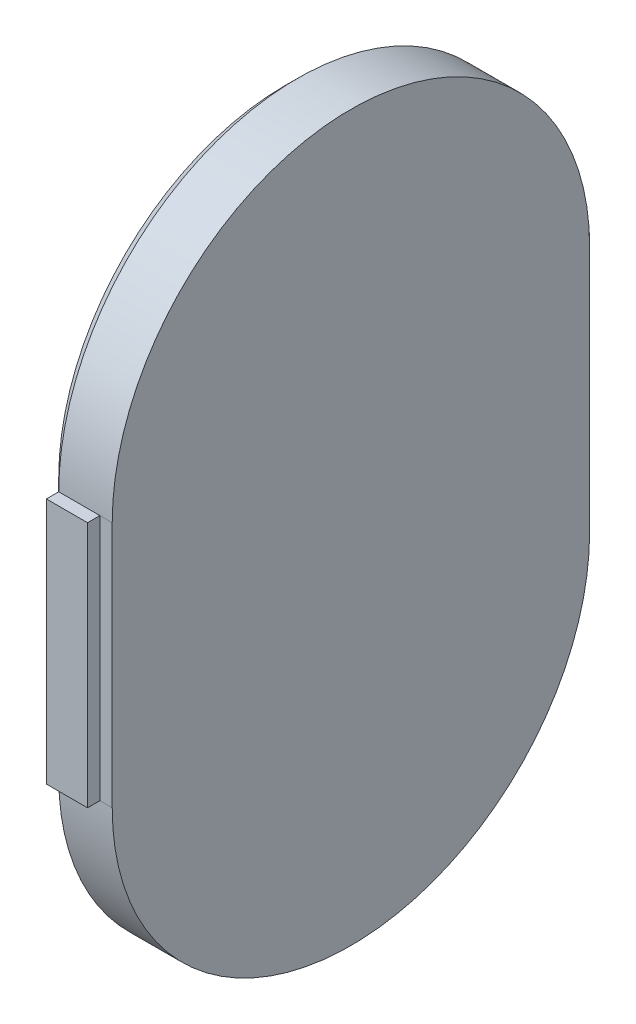
ISO-10303-21;
HEADER;
FILE_DESCRIPTION(('STEP AP214'),'2;1');
FILE_NAME('part.step','',(''),(''),'','','');
FILE_SCHEMA(('AUTOMOTIVE_DESIGN { 1 0 10303 214 1 1 1 1 }'));
ENDSEC;
DATA;
#1=APPLICATION_CONTEXT('core data for automotive mechanical design processes');
#2=APPLICATION_PROTOCOL_DEFINITION('international standard','automotive_design',2000,#1);
#3=PRODUCT_CONTEXT('',#1,'mechanical');
#4=PRODUCT('Part','Part','',(#3));
#5=PRODUCT_RELATED_PRODUCT_CATEGORY('part','',(#4));
#6=PRODUCT_DEFINITION_FORMATION('','',#4);
#7=PRODUCT_DEFINITION_CONTEXT('part definition',#1,'design');
#8=PRODUCT_DEFINITION('design','',#6,#7);
#9=PRODUCT_DEFINITION_SHAPE('','',#8);
#10=(LENGTH_UNIT() NAMED_UNIT(*) SI_UNIT(.MILLI.,.METRE.));
#11=(NAMED_UNIT(*) PLANE_ANGLE_UNIT() SI_UNIT($,.RADIAN.));
#12=(NAMED_UNIT(*) SI_UNIT($,.STERADIAN.) SOLID_ANGLE_UNIT());
#13=UNCERTAINTY_MEASURE_WITH_UNIT(LENGTH_MEASURE(1.E-05),#10,'distance_accuracy_value','');
#14=(GEOMETRIC_REPRESENTATION_CONTEXT(3) GLOBAL_UNCERTAINTY_ASSIGNED_CONTEXT((#13)) GLOBAL_UNIT_ASSIGNED_CONTEXT((#10,
#11,#12)) REPRESENTATION_CONTEXT('',''));
#15=CARTESIAN_POINT('',(0.,0.,0.));
#16=DIRECTION('',(0.,0.,1.));
#17=DIRECTION('',(1.,0.,0.));
#18=AXIS2_PLACEMENT_3D('',#15,#16,#17);
#19=CARTESIAN_POINT('',(-61.4,110.,67.4));
#20=DIRECTION('',(-1.,0.,0.));
#21=DIRECTION('',(0.,0.,1.));
#22=AXIS2_PLACEMENT_3D('',#19,#20,#21);
#23=CYLINDRICAL_SURFACE('',#22,5.8);
#24=DIRECTION('',(-1.,0.,0.));
#25=VECTOR('',#24,1.);
#26=CARTESIAN_POINT('',(-61.4,104.397322068867,68.9));
#27=LINE('',#26,#25);
#28=CARTESIAN_POINT('',(-62.4,104.397322068867,68.9));
#29=VERTEX_POINT('',#28);
#30=CARTESIAN_POINT('',(-62.7,104.397322068867,68.9));
#31=VERTEX_POINT('',#30);
#32=EDGE_CURVE('E210',#29,#31,#27,.T.);
#33=ORIENTED_EDGE('',*,*,#32,.F.);
#34=CARTESIAN_POINT('',(-62.4,110.,67.4));
#35=DIRECTION('',(-1.,0.,0.));
#36=DIRECTION('',(0.,0.,1.));
#37=AXIS2_PLACEMENT_3D('',#34,#35,#36);
#38=CIRCLE('',#37,5.8);
#39=CARTESIAN_POINT('',(-62.4,104.397322068867,65.9));
#40=VERTEX_POINT('',#39);
#41=EDGE_CURVE('E11',#40,#29,#38,.T.);
#42=ORIENTED_EDGE('',*,*,#41,.F.);
#43=DIRECTION('',(-1.,0.,0.));
#44=VECTOR('',#43,1.);
#45=CARTESIAN_POINT('',(-61.4,104.397322068867,65.9));
#46=LINE('',#45,#44);
#47=CARTESIAN_POINT('',(-62.7,104.397322068867,65.9));
#48=VERTEX_POINT('',#47);
#49=EDGE_CURVE('E204',#40,#48,#46,.T.);
#50=ORIENTED_EDGE('',*,*,#49,.T.);
#51=CARTESIAN_POINT('',(-62.7,110.,67.4));
#52=DIRECTION('',(-1.,0.,0.));
#53=DIRECTION('',(0.,0.,1.));
#54=AXIS2_PLACEMENT_3D('',#51,#52,#53);
#55=CIRCLE('',#54,5.8);
#56=CARTESIAN_POINT('',(-62.7,110.,61.6));
#57=VERTEX_POINT('',#56);
#58=EDGE_CURVE('E312',#48,#57,#55,.F.);
#59=ORIENTED_EDGE('',*,*,#58,.T.);
#60=DIRECTION('',(-1.,0.,0.));
#61=VECTOR('',#60,1.);
#62=CARTESIAN_POINT('',(-61.4,110.,61.6));
#63=LINE('',#62,#61);
#64=CARTESIAN_POINT('',(-61.7,110.,61.6));
#65=VERTEX_POINT('',#64);
#66=EDGE_CURVE('E307',#65,#57,#63,.T.);
#67=ORIENTED_EDGE('',*,*,#66,.F.);
#68=CARTESIAN_POINT('',(-61.4,110.,61.6));
#69=VERTEX_POINT('',#68);
#70=EDGE_CURVE('E308',#69,#65,#63,.T.);
#71=ORIENTED_EDGE('',*,*,#70,.F.);
#72=CARTESIAN_POINT('',(-61.4,110.,67.4));
#73=DIRECTION('',(1.,0.,0.));
#74=DIRECTION('',(0.,0.,1.));
#75=AXIS2_PLACEMENT_3D('',#72,#73,#74);
#76=CIRCLE('',#75,5.8);
#77=CARTESIAN_POINT('',(-61.4,110.,73.2));
#78=VERTEX_POINT('',#77);
#79=EDGE_CURVE('E279',#78,#69,#76,.T.);
#80=ORIENTED_EDGE('',*,*,#79,.F.);
#81=DIRECTION('',(-1.,0.,0.));
#82=VECTOR('',#81,1.);
#83=CARTESIAN_POINT('',(-61.4,110.,73.2));
#84=LINE('',#83,#82);
#85=CARTESIAN_POINT('',(-61.7,110.,73.2));
#86=VERTEX_POINT('',#85);
#87=EDGE_CURVE('E295',#78,#86,#84,.T.);
#88=ORIENTED_EDGE('',*,*,#87,.T.);
#89=CARTESIAN_POINT('',(-62.7,110.,73.2));
#90=VERTEX_POINT('',#89);
#91=EDGE_CURVE('E294',#86,#90,#84,.T.);
#92=ORIENTED_EDGE('',*,*,#91,.T.);
#93=EDGE_CURVE('E313',#90,#31,#55,.F.);
#94=ORIENTED_EDGE('',*,*,#93,.T.);
#95=EDGE_LOOP('',(#33,#42,#50,#59,#67,#71,#80,#88,#92,#94));
#96=FACE_BOUND('',#95,.T.);
#97=ADVANCED_FACE('F49',(#96),#23,.T.);
#98=CARTESIAN_POINT('',(-63.,110.,67.4));
#99=DIRECTION('',(-1.,0.,0.));
#100=DIRECTION('',(0.,0.,1.));
#101=AXIS2_PLACEMENT_3D('',#98,#99,#100);
#102=PLANE('',#101);
#103=DIRECTION('',(0.,0.,1.));
#104=VECTOR('',#103,1.);
#105=CARTESIAN_POINT('',(-63.,105.4,67.4));
#106=LINE('',#105,#104);
#107=CARTESIAN_POINT('',(-63.,105.4,65.9));
#108=VERTEX_POINT('',#107);
#109=CARTESIAN_POINT('',(-63.,105.4,68.9));
#110=VERTEX_POINT('',#109);
#111=EDGE_CURVE('E59',#108,#110,#106,.T.);
#112=ORIENTED_EDGE('',*,*,#111,.T.);
#113=DIRECTION('',(0.,-1.,0.));
#114=VECTOR('',#113,1.);
#115=CARTESIAN_POINT('',(-63.,110.,68.9));
#116=LINE('',#115,#114);
#117=CARTESIAN_POINT('',(-63.,104.708497377871,68.9));
#118=VERTEX_POINT('',#117);
#119=EDGE_CURVE('E193',#110,#118,#116,.T.);
#120=ORIENTED_EDGE('',*,*,#119,.T.);
#121=CARTESIAN_POINT('',(-63.,110.,67.4));
#122=DIRECTION('',(-1.,0.,0.));
#123=DIRECTION('',(0.,0.,1.));
#124=AXIS2_PLACEMENT_3D('',#121,#122,#123);
#125=CIRCLE('',#124,5.50000000000001);
#126=CARTESIAN_POINT('',(-63.,110.,72.9));
#127=VERTEX_POINT('',#126);
#128=EDGE_CURVE('E326',#118,#127,#125,.T.);
#129=ORIENTED_EDGE('',*,*,#128,.T.);
#130=DIRECTION('',(0.,1.,0.));
#131=VECTOR('',#130,1.);
#132=CARTESIAN_POINT('',(-63.,116.,72.9));
#133=LINE('',#132,#131);
#134=CARTESIAN_POINT('',(-63.,116.,72.9));
#135=VERTEX_POINT('',#134);
#136=EDGE_CURVE('E320',#127,#135,#133,.T.);
#137=ORIENTED_EDGE('',*,*,#136,.T.);
#138=CARTESIAN_POINT('',(-63.,116.,67.4));
#139=DIRECTION('',(-1.,0.,0.));
#140=DIRECTION('',(0.,0.,1.));
#141=AXIS2_PLACEMENT_3D('',#138,#139,#140);
#142=CIRCLE('',#141,5.50000000000001);
#143=CARTESIAN_POINT('',(-63.,116.,61.9));
#144=VERTEX_POINT('',#143);
#145=EDGE_CURVE('E317',#135,#144,#142,.T.);
#146=ORIENTED_EDGE('',*,*,#145,.T.);
#147=DIRECTION('',(0.,-1.,0.));
#148=VECTOR('',#147,1.);
#149=CARTESIAN_POINT('',(-63.,110.,61.9));
#150=LINE('',#149,#148);
#151=CARTESIAN_POINT('',(-63.,110.,61.9));
#152=VERTEX_POINT('',#151);
#153=EDGE_CURVE('E323',#144,#152,#150,.T.);
#154=ORIENTED_EDGE('',*,*,#153,.T.);
#155=CARTESIAN_POINT('',(-63.,104.708497377871,65.9));
#156=VERTEX_POINT('',#155);
#157=EDGE_CURVE('E327',#152,#156,#125,.T.);
#158=ORIENTED_EDGE('',*,*,#157,.T.);
#159=DIRECTION('',(0.,-1.,0.));
#160=VECTOR('',#159,1.);
#161=CARTESIAN_POINT('',(-63.,110.,65.9));
#162=LINE('',#161,#160);
#163=EDGE_CURVE('E66',#108,#156,#162,.T.);
#164=ORIENTED_EDGE('',*,*,#163,.F.);
#165=EDGE_LOOP('',(#112,#120,#129,#137,#146,#154,#158,#164));
#166=FACE_BOUND('',#165,.T.);
#167=ADVANCED_FACE('F429',(#166),#102,.T.);
#168=CARTESIAN_POINT('',(-62.7,110.,67.4));
#169=DIRECTION('',(1.,0.,0.));
#170=DIRECTION('',(0.,0.,-1.));
#171=AXIS2_PLACEMENT_3D('',#168,#169,#170);
#172=CONICAL_SURFACE('',#171,5.8,0.785398163397448);
#173=ORIENTED_EDGE('',*,*,#128,.F.);
#174=CARTESIAN_POINT('',(-64.2371316876853,106.00975611671,68.9));
#175=CARTESIAN_POINT('',(-64.1231499809189,105.887999964926,68.9));
#176=CARTESIAN_POINT('',(-64.0088383775944,105.766553873108,68.9));
#177=CARTESIAN_POINT('',(-63.7796767548246,105.524172135007,68.9));
#178=CARTESIAN_POINT('',(-63.6648267390506,105.403236485253,68.9));
#179=CARTESIAN_POINT('',(-63.3196546032696,105.041034299892,68.9));
#180=CARTESIAN_POINT('',(-63.088704633507,104.800366398064,68.9));
#181=CARTESIAN_POINT('',(-62.6257121524155,104.320093699818,68.9));
#182=CARTESIAN_POINT('',(-62.3936696597395,104.080488885385,68.9));
#183=CARTESIAN_POINT('',(-61.9287883147822,103.602040927902,68.9));
#184=CARTESIAN_POINT('',(-61.6959494424737,103.363197804304,68.9));
#185=CARTESIAN_POINT('',(-61.4628683123147,103.124592929155,68.9));
#186=B_SPLINE_CURVE_WITH_KNOTS('',3,(#174,#175,#176,#177,#178,#179,#180,#181,#182,#183,#184,
#185),.UNSPECIFIED.,.F.,.F.,(4,2,2,2,2,4),(0.,0.500345452602869,1.00068749826315,
2.00134635262799,3.00198818415704,4.00265536751893),.UNSPECIFIED.);
#187=EDGE_CURVE('E364',#118,#31,#186,.T.);
#188=ORIENTED_EDGE('',*,*,#187,.T.);
#189=ORIENTED_EDGE('',*,*,#93,.F.);
#190=DIRECTION('',(-0.707106781186547,0.,-0.707106781186547));
#191=VECTOR('',#190,1.);
#192=CARTESIAN_POINT('',(-62.7,110.,73.2));
#193=LINE('',#192,#191);
#194=EDGE_CURVE('E346',#90,#127,#193,.T.);
#195=ORIENTED_EDGE('',*,*,#194,.T.);
#196=EDGE_LOOP('',(#173,#188,#189,#195));
#197=FACE_BOUND('',#196,.T.);
#198=ADVANCED_FACE('F432',(#197),#172,.T.);
#199=CARTESIAN_POINT('',(-61.4,110.,73.2));
#200=DIRECTION('',(0.,0.,-1.));
#201=DIRECTION('',(-1.,0.,0.));
#202=AXIS2_PLACEMENT_3D('',#199,#200,#201);
#203=PLANE('',#202);
#204=DIRECTION('',(0.,1.,0.));
#205=VECTOR('',#204,1.);
#206=CARTESIAN_POINT('',(-61.7,110.,73.2));
#207=LINE('',#206,#205);
#208=CARTESIAN_POINT('',(-61.7,116.,73.2));
#209=VERTEX_POINT('',#208);
#210=EDGE_CURVE('E242',#86,#209,#207,.T.);
#211=ORIENTED_EDGE('',*,*,#210,.F.);
#212=ORIENTED_EDGE('',*,*,#87,.F.);
#213=DIRECTION('',(0.,-1.,0.));
#214=VECTOR('',#213,1.);
#215=CARTESIAN_POINT('',(-61.4,110.,73.2));
#216=LINE('',#215,#214);
#217=CARTESIAN_POINT('',(-61.4,116.,73.2));
#218=VERTEX_POINT('',#217);
#219=EDGE_CURVE('E290',#218,#78,#216,.T.);
#220=ORIENTED_EDGE('',*,*,#219,.F.);
#221=DIRECTION('',(-1.,0.,0.));
#222=VECTOR('',#221,1.);
#223=CARTESIAN_POINT('',(-61.4,116.,73.2));
#224=LINE('',#223,#222);
#225=EDGE_CURVE('E299',#218,#209,#224,.T.);
#226=ORIENTED_EDGE('',*,*,#225,.T.);
#227=EDGE_LOOP('',(#211,#212,#220,#226));
#228=FACE_BOUND('',#227,.T.);
#229=ADVANCED_FACE('F437',(#228),#203,.F.);
#230=CARTESIAN_POINT('',(-61.4,116.,61.6));
#231=DIRECTION('',(0.,0.,1.));
#232=DIRECTION('',(1.,0.,0.));
#233=AXIS2_PLACEMENT_3D('',#230,#231,#232);
#234=PLANE('',#233);
#235=DIRECTION('',(0.,-1.,0.));
#236=VECTOR('',#235,1.);
#237=CARTESIAN_POINT('',(-61.7,116.,61.6));
#238=LINE('',#237,#236);
#239=CARTESIAN_POINT('',(-61.7,116.,61.6));
#240=VERTEX_POINT('',#239);
#241=EDGE_CURVE('E274',#240,#65,#238,.T.);
#242=ORIENTED_EDGE('',*,*,#241,.F.);
#243=DIRECTION('',(-1.,0.,0.));
#244=VECTOR('',#243,1.);
#245=CARTESIAN_POINT('',(-61.4,116.,61.6));
#246=LINE('',#245,#244);
#247=CARTESIAN_POINT('',(-61.4,116.,61.6));
#248=VERTEX_POINT('',#247);
#249=EDGE_CURVE('E303',#248,#240,#246,.T.);
#250=ORIENTED_EDGE('',*,*,#249,.F.);
#251=DIRECTION('',(0.,1.,0.));
#252=VECTOR('',#251,1.);
#253=CARTESIAN_POINT('',(-61.4,116.,61.6));
#254=LINE('',#253,#252);
#255=EDGE_CURVE('E283',#69,#248,#254,.T.);
#256=ORIENTED_EDGE('',*,*,#255,.F.);
#257=ORIENTED_EDGE('',*,*,#70,.T.);
#258=EDGE_LOOP('',(#242,#250,#256,#257));
#259=FACE_BOUND('',#258,.T.);
#260=ADVANCED_FACE('F440',(#259),#234,.F.);
#261=CARTESIAN_POINT('',(-61.4,116.,67.4));
#262=DIRECTION('',(-1.,0.,0.));
#263=DIRECTION('',(0.,0.,1.));
#264=AXIS2_PLACEMENT_3D('',#261,#262,#263);
#265=CYLINDRICAL_SURFACE('',#264,5.8);
#266=ORIENTED_EDGE('',*,*,#249,.T.);
#267=CARTESIAN_POINT('',(-62.7,116.,61.6));
#268=VERTEX_POINT('',#267);
#269=EDGE_CURVE('E302',#240,#268,#246,.T.);
#270=ORIENTED_EDGE('',*,*,#269,.T.);
#271=CARTESIAN_POINT('',(-62.7,116.,67.4));
#272=DIRECTION('',(-1.,0.,0.));
#273=DIRECTION('',(0.,0.,1.));
#274=AXIS2_PLACEMENT_3D('',#271,#272,#273);
#275=CIRCLE('',#274,5.8);
#276=CARTESIAN_POINT('',(-62.7,116.,73.2));
#277=VERTEX_POINT('',#276);
#278=EDGE_CURVE('E339',#268,#277,#275,.F.);
#279=ORIENTED_EDGE('',*,*,#278,.T.);
#280=EDGE_CURVE('E74',#209,#277,#224,.T.);
#281=ORIENTED_EDGE('',*,*,#280,.F.);
#282=ORIENTED_EDGE('',*,*,#225,.F.);
#283=CARTESIAN_POINT('',(-61.4,116.,67.4));
#284=DIRECTION('',(1.,0.,0.));
#285=DIRECTION('',(0.,0.,1.));
#286=AXIS2_PLACEMENT_3D('',#283,#284,#285);
#287=CIRCLE('',#286,5.8);
#288=EDGE_CURVE('E287',#248,#218,#287,.T.);
#289=ORIENTED_EDGE('',*,*,#288,.F.);
#290=EDGE_LOOP('',(#266,#270,#279,#281,#282,#289));
#291=FACE_BOUND('',#290,.T.);
#292=ADVANCED_FACE('F427',(#291),#265,.T.);
#293=CARTESIAN_POINT('',(-61.4,110.,67.4));
#294=DIRECTION('',(-1.,0.,0.));
#295=DIRECTION('',(0.,0.,1.));
#296=AXIS2_PLACEMENT_3D('',#293,#294,#295);
#297=PLANE('',#296);
#298=ORIENTED_EDGE('',*,*,#79,.T.);
#299=ORIENTED_EDGE('',*,*,#255,.T.);
#300=ORIENTED_EDGE('',*,*,#288,.T.);
#301=ORIENTED_EDGE('',*,*,#219,.T.);
#302=EDGE_LOOP('',(#298,#299,#300,#301));
#303=FACE_BOUND('',#302,.T.);
#304=ADVANCED_FACE('F424',(#303),#297,.F.);
#305=CARTESIAN_POINT('',(-62.7,116.,67.4));
#306=DIRECTION('',(1.,0.,0.));
#307=DIRECTION('',(0.,0.,-1.));
#308=AXIS2_PLACEMENT_3D('',#305,#306,#307);
#309=CONICAL_SURFACE('',#308,5.8,0.785398163397448);
#310=DIRECTION('',(0.707106781186547,0.,-0.707106781186547));
#311=VECTOR('',#310,1.);
#312=CARTESIAN_POINT('',(-63.,116.,61.9));
#313=LINE('',#312,#311);
#314=EDGE_CURVE('E350',#144,#268,#313,.T.);
#315=ORIENTED_EDGE('',*,*,#314,.F.);
#316=ORIENTED_EDGE('',*,*,#145,.F.);
#317=DIRECTION('',(-0.707106781186547,0.,-0.707106781186547));
#318=VECTOR('',#317,1.);
#319=CARTESIAN_POINT('',(-62.7,116.,73.2));
#320=LINE('',#319,#318);
#321=EDGE_CURVE('E284',#277,#135,#320,.T.);
#322=ORIENTED_EDGE('',*,*,#321,.F.);
#323=ORIENTED_EDGE('',*,*,#278,.F.);
#324=EDGE_LOOP('',(#315,#316,#322,#323));
#325=FACE_BOUND('',#324,.T.);
#326=ADVANCED_FACE('F52',(#325),#309,.T.);
#327=CARTESIAN_POINT('',(-62.7,110.,73.2));
#328=DIRECTION('',(-0.707106781186547,0.,0.707106781186547));
#329=DIRECTION('',(0.,1.,0.));
#330=AXIS2_PLACEMENT_3D('',#327,#328,#329);
#331=PLANE('',#330);
#332=ORIENTED_EDGE('',*,*,#321,.T.);
#333=ORIENTED_EDGE('',*,*,#136,.F.);
#334=ORIENTED_EDGE('',*,*,#194,.F.);
#335=DIRECTION('',(0.,-1.,0.));
#336=VECTOR('',#335,1.);
#337=CARTESIAN_POINT('',(-62.7,110.,73.2));
#338=LINE('',#337,#336);
#339=EDGE_CURVE('E335',#277,#90,#338,.T.);
#340=ORIENTED_EDGE('',*,*,#339,.F.);
#341=EDGE_LOOP('',(#332,#333,#334,#340));
#342=FACE_BOUND('',#341,.T.);
#343=ADVANCED_FACE('F489',(#342),#331,.T.);
#344=CARTESIAN_POINT('',(-62.7,116.,61.6));
#345=DIRECTION('',(-0.707106781186547,0.,-0.707106781186547));
#346=DIRECTION('',(0.,-1.,0.));
#347=AXIS2_PLACEMENT_3D('',#344,#345,#346);
#348=PLANE('',#347);
#349=ORIENTED_EDGE('',*,*,#314,.T.);
#350=DIRECTION('',(0.,1.,0.));
#351=VECTOR('',#350,1.);
#352=CARTESIAN_POINT('',(-62.7,116.,61.6));
#353=LINE('',#352,#351);
#354=EDGE_CURVE('E331',#57,#268,#353,.T.);
#355=ORIENTED_EDGE('',*,*,#354,.F.);
#356=DIRECTION('',(0.707106781186547,0.,-0.707106781186547));
#357=VECTOR('',#356,1.);
#358=CARTESIAN_POINT('',(-63.,110.,61.9));
#359=LINE('',#358,#357);
#360=EDGE_CURVE('E278',#152,#57,#359,.T.);
#361=ORIENTED_EDGE('',*,*,#360,.F.);
#362=ORIENTED_EDGE('',*,*,#153,.F.);
#363=EDGE_LOOP('',(#349,#355,#361,#362));
#364=FACE_BOUND('',#363,.T.);
#365=ADVANCED_FACE('F467',(#364),#348,.T.);
#366=CARTESIAN_POINT('',(-64.2371316876853,106.00975611671,65.9));
#367=CARTESIAN_POINT('',(-64.1231499809189,105.887999964926,65.9));
#368=CARTESIAN_POINT('',(-64.0088383775944,105.766553873108,65.9));
#369=CARTESIAN_POINT('',(-63.7796767548246,105.524172135007,65.9));
#370=CARTESIAN_POINT('',(-63.6648267390506,105.403236485253,65.9));
#371=CARTESIAN_POINT('',(-63.3196546032696,105.041034299892,65.9));
#372=CARTESIAN_POINT('',(-63.088704633507,104.800366398064,65.9));
#373=CARTESIAN_POINT('',(-62.6257121524155,104.320093699818,65.9));
#374=CARTESIAN_POINT('',(-62.3936696597395,104.080488885385,65.9));
#375=CARTESIAN_POINT('',(-61.9287883147822,103.602040927902,65.9));
#376=CARTESIAN_POINT('',(-61.6959494424737,103.363197804304,65.9));
#377=CARTESIAN_POINT('',(-61.4628683123147,103.124592929155,65.9));
#378=B_SPLINE_CURVE_WITH_KNOTS('',3,(#366,#367,#368,#369,#370,#371,#372,#373,#374,#375,#376,
#377),.UNSPECIFIED.,.F.,.F.,(4,2,2,2,2,4),(0.,0.500345452602869,1.00068749826315,
2.00134635262799,3.00198818415704,4.00265536751893),.UNSPECIFIED.);
#379=EDGE_CURVE('E342',#156,#48,#378,.T.);
#380=ORIENTED_EDGE('',*,*,#379,.F.);
#381=ORIENTED_EDGE('',*,*,#157,.F.);
#382=ORIENTED_EDGE('',*,*,#360,.T.);
#383=ORIENTED_EDGE('',*,*,#58,.F.);
#384=EDGE_LOOP('',(#380,#381,#382,#383));
#385=FACE_BOUND('',#384,.T.);
#386=ADVANCED_FACE('F371',(#385),#172,.T.);
#387=CARTESIAN_POINT('',(-62.7,116.,61.61));
#388=DIRECTION('',(0.,-1.,0.));
#389=DIRECTION('',(0.,0.,-1.));
#390=AXIS2_PLACEMENT_3D('',#387,#388,#389);
#391=PLANE('',#390);
#392=DIRECTION('',(0.,0.,-1.));
#393=VECTOR('',#392,1.);
#394=CARTESIAN_POINT('',(-62.7,116.,61.61));
#395=LINE('',#394,#393);
#396=CARTESIAN_POINT('',(-62.7,116.,61.3));
#397=VERTEX_POINT('',#396);
#398=EDGE_CURVE('E262',#268,#397,#395,.T.);
#399=ORIENTED_EDGE('',*,*,#398,.F.);
#400=ORIENTED_EDGE('',*,*,#269,.F.);
#401=DIRECTION('',(0.,0.,-1.));
#402=VECTOR('',#401,1.);
#403=CARTESIAN_POINT('',(-61.7,116.,61.61));
#404=LINE('',#403,#402);
#405=CARTESIAN_POINT('',(-61.7,116.,61.3));
#406=VERTEX_POINT('',#405);
#407=EDGE_CURVE('E265',#240,#406,#404,.T.);
#408=ORIENTED_EDGE('',*,*,#407,.T.);
#409=DIRECTION('',(-1.,0.,0.));
#410=VECTOR('',#409,1.);
#411=CARTESIAN_POINT('',(-62.7,116.,61.3));
#412=LINE('',#411,#410);
#413=EDGE_CURVE('E258',#406,#397,#412,.T.);
#414=ORIENTED_EDGE('',*,*,#413,.T.);
#415=EDGE_LOOP('',(#399,#400,#408,#414));
#416=FACE_BOUND('',#415,.T.);
#417=ADVANCED_FACE('F409',(#416),#391,.F.);
#418=CARTESIAN_POINT('',(-62.7,110.,61.61));
#419=DIRECTION('',(0.,1.,0.));
#420=DIRECTION('',(0.,0.,1.));
#421=AXIS2_PLACEMENT_3D('',#418,#419,#420);
#422=PLANE('',#421);
#423=DIRECTION('',(0.,0.,-1.));
#424=VECTOR('',#423,1.);
#425=CARTESIAN_POINT('',(-61.7,110.,61.61));
#426=LINE('',#425,#424);
#427=CARTESIAN_POINT('',(-61.7,110.,61.3));
#428=VERTEX_POINT('',#427);
#429=EDGE_CURVE('E268',#65,#428,#426,.T.);
#430=ORIENTED_EDGE('',*,*,#429,.F.);
#431=ORIENTED_EDGE('',*,*,#66,.T.);
#432=DIRECTION('',(0.,0.,-1.));
#433=VECTOR('',#432,1.);
#434=CARTESIAN_POINT('',(-62.7,110.,61.61));
#435=LINE('',#434,#433);
#436=CARTESIAN_POINT('',(-62.7,110.,61.3));
#437=VERTEX_POINT('',#436);
#438=EDGE_CURVE('E271',#57,#437,#435,.T.);
#439=ORIENTED_EDGE('',*,*,#438,.T.);
#440=DIRECTION('',(1.,0.,0.));
#441=VECTOR('',#440,1.);
#442=CARTESIAN_POINT('',(-62.7,110.,61.3));
#443=LINE('',#442,#441);
#444=EDGE_CURVE('E250',#437,#428,#443,.T.);
#445=ORIENTED_EDGE('',*,*,#444,.T.);
#446=EDGE_LOOP('',(#430,#431,#439,#445));
#447=FACE_BOUND('',#446,.T.);
#448=ADVANCED_FACE('F412',(#447),#422,.F.);
#449=CARTESIAN_POINT('',(-62.7,110.,61.61));
#450=DIRECTION('',(1.,0.,0.));
#451=DIRECTION('',(0.,0.,-1.));
#452=AXIS2_PLACEMENT_3D('',#449,#450,#451);
#453=PLANE('',#452);
#454=ORIENTED_EDGE('',*,*,#354,.T.);
#455=ORIENTED_EDGE('',*,*,#398,.T.);
#456=DIRECTION('',(0.,-1.,0.));
#457=VECTOR('',#456,1.);
#458=CARTESIAN_POINT('',(-62.7,110.,61.3));
#459=LINE('',#458,#457);
#460=EDGE_CURVE('E246',#397,#437,#459,.T.);
#461=ORIENTED_EDGE('',*,*,#460,.T.);
#462=ORIENTED_EDGE('',*,*,#438,.F.);
#463=EDGE_LOOP('',(#454,#455,#461,#462));
#464=FACE_BOUND('',#463,.T.);
#465=ADVANCED_FACE('F416',(#464),#453,.F.);
#466=CARTESIAN_POINT('',(-61.7,110.,61.61));
#467=DIRECTION('',(-1.,0.,0.));
#468=DIRECTION('',(0.,0.,1.));
#469=AXIS2_PLACEMENT_3D('',#466,#467,#468);
#470=PLANE('',#469);
#471=ORIENTED_EDGE('',*,*,#407,.F.);
#472=ORIENTED_EDGE('',*,*,#241,.T.);
#473=ORIENTED_EDGE('',*,*,#429,.T.);
#474=DIRECTION('',(0.,1.,0.));
#475=VECTOR('',#474,1.);
#476=CARTESIAN_POINT('',(-61.7,110.,61.3));
#477=LINE('',#476,#475);
#478=EDGE_CURVE('E254',#428,#406,#477,.T.);
#479=ORIENTED_EDGE('',*,*,#478,.T.);
#480=EDGE_LOOP('',(#471,#472,#473,#479));
#481=FACE_BOUND('',#480,.T.);
#482=ADVANCED_FACE('F407',(#481),#470,.F.);
#483=CARTESIAN_POINT('',(0.,0.,61.3));
#484=DIRECTION('',(0.,0.,-1.));
#485=DIRECTION('',(-1.,0.,0.));
#486=AXIS2_PLACEMENT_3D('',#483,#484,#485);
#487=PLANE('',#486);
#488=ORIENTED_EDGE('',*,*,#460,.F.);
#489=ORIENTED_EDGE('',*,*,#413,.F.);
#490=ORIENTED_EDGE('',*,*,#478,.F.);
#491=ORIENTED_EDGE('',*,*,#444,.F.);
#492=EDGE_LOOP('',(#488,#489,#490,#491));
#493=FACE_BOUND('',#492,.T.);
#494=ADVANCED_FACE('F393',(#493),#487,.T.);
#495=CARTESIAN_POINT('',(-62.7,116.,73.5));
#496=DIRECTION('',(0.,-1.,0.));
#497=DIRECTION('',(0.,0.,-1.));
#498=AXIS2_PLACEMENT_3D('',#495,#496,#497);
#499=PLANE('',#498);
#500=DIRECTION('',(0.,0.,-1.));
#501=VECTOR('',#500,1.);
#502=CARTESIAN_POINT('',(-61.7,116.,73.5));
#503=LINE('',#502,#501);
#504=CARTESIAN_POINT('',(-61.7,116.,73.5));
#505=VERTEX_POINT('',#504);
#506=EDGE_CURVE('E230',#505,#209,#503,.T.);
#507=ORIENTED_EDGE('',*,*,#506,.T.);
#508=ORIENTED_EDGE('',*,*,#280,.T.);
#509=DIRECTION('',(0.,0.,-1.));
#510=VECTOR('',#509,1.);
#511=CARTESIAN_POINT('',(-62.7,116.,73.5));
#512=LINE('',#511,#510);
#513=CARTESIAN_POINT('',(-62.7,116.,73.5));
#514=VERTEX_POINT('',#513);
#515=EDGE_CURVE('E226',#514,#277,#512,.T.);
#516=ORIENTED_EDGE('',*,*,#515,.F.);
#517=DIRECTION('',(-1.,0.,0.));
#518=VECTOR('',#517,1.);
#519=CARTESIAN_POINT('',(-62.7,116.,73.5));
#520=LINE('',#519,#518);
#521=EDGE_CURVE('E223',#505,#514,#520,.T.);
#522=ORIENTED_EDGE('',*,*,#521,.F.);
#523=EDGE_LOOP('',(#507,#508,#516,#522));
#524=FACE_BOUND('',#523,.T.);
#525=ADVANCED_FACE('F389',(#524),#499,.F.);
#526=CARTESIAN_POINT('',(-62.7,110.,73.5));
#527=DIRECTION('',(0.,1.,0.));
#528=DIRECTION('',(0.,0.,1.));
#529=AXIS2_PLACEMENT_3D('',#526,#527,#528);
#530=PLANE('',#529);
#531=DIRECTION('',(0.,0.,-1.));
#532=VECTOR('',#531,1.);
#533=CARTESIAN_POINT('',(-62.7,110.,73.5));
#534=LINE('',#533,#532);
#535=CARTESIAN_POINT('',(-62.7,110.,73.5));
#536=VERTEX_POINT('',#535);
#537=EDGE_CURVE('E238',#536,#90,#534,.T.);
#538=ORIENTED_EDGE('',*,*,#537,.T.);
#539=ORIENTED_EDGE('',*,*,#91,.F.);
#540=DIRECTION('',(0.,0.,-1.));
#541=VECTOR('',#540,1.);
#542=CARTESIAN_POINT('',(-61.7,110.,73.5));
#543=LINE('',#542,#541);
#544=CARTESIAN_POINT('',(-61.7,110.,73.5));
#545=VERTEX_POINT('',#544);
#546=EDGE_CURVE('E234',#545,#86,#543,.T.);
#547=ORIENTED_EDGE('',*,*,#546,.F.);
#548=DIRECTION('',(1.,0.,0.));
#549=VECTOR('',#548,1.);
#550=CARTESIAN_POINT('',(-62.7,110.,73.5));
#551=LINE('',#550,#549);
#552=EDGE_CURVE('E217',#536,#545,#551,.T.);
#553=ORIENTED_EDGE('',*,*,#552,.F.);
#554=EDGE_LOOP('',(#538,#539,#547,#553));
#555=FACE_BOUND('',#554,.T.);
#556=ADVANCED_FACE('F392',(#555),#530,.F.);
#557=CARTESIAN_POINT('',(-62.7,110.,73.5));
#558=DIRECTION('',(1.,0.,0.));
#559=DIRECTION('',(0.,0.,-1.));
#560=AXIS2_PLACEMENT_3D('',#557,#558,#559);
#561=PLANE('',#560);
#562=ORIENTED_EDGE('',*,*,#339,.T.);
#563=ORIENTED_EDGE('',*,*,#537,.F.);
#564=DIRECTION('',(0.,-1.,0.));
#565=VECTOR('',#564,1.);
#566=CARTESIAN_POINT('',(-62.7,110.,73.5));
#567=LINE('',#566,#565);
#568=EDGE_CURVE('E213',#514,#536,#567,.T.);
#569=ORIENTED_EDGE('',*,*,#568,.F.);
#570=ORIENTED_EDGE('',*,*,#515,.T.);
#571=EDGE_LOOP('',(#562,#563,#569,#570));
#572=FACE_BOUND('',#571,.T.);
#573=ADVANCED_FACE('F397',(#572),#561,.F.);
#574=CARTESIAN_POINT('',(-61.7,110.,73.5));
#575=DIRECTION('',(-1.,0.,0.));
#576=DIRECTION('',(0.,0.,1.));
#577=AXIS2_PLACEMENT_3D('',#574,#575,#576);
#578=PLANE('',#577);
#579=ORIENTED_EDGE('',*,*,#546,.T.);
#580=ORIENTED_EDGE('',*,*,#210,.T.);
#581=ORIENTED_EDGE('',*,*,#506,.F.);
#582=DIRECTION('',(0.,1.,0.));
#583=VECTOR('',#582,1.);
#584=CARTESIAN_POINT('',(-61.7,110.,73.5));
#585=LINE('',#584,#583);
#586=EDGE_CURVE('E220',#545,#505,#585,.T.);
#587=ORIENTED_EDGE('',*,*,#586,.F.);
#588=EDGE_LOOP('',(#579,#580,#581,#587));
#589=FACE_BOUND('',#588,.T.);
#590=ADVANCED_FACE('F387',(#589),#578,.F.);
#591=CARTESIAN_POINT('',(0.,0.,73.5));
#592=DIRECTION('',(0.,0.,-1.));
#593=DIRECTION('',(-1.,0.,0.));
#594=AXIS2_PLACEMENT_3D('',#591,#592,#593);
#595=PLANE('',#594);
#596=ORIENTED_EDGE('',*,*,#568,.T.);
#597=ORIENTED_EDGE('',*,*,#552,.T.);
#598=ORIENTED_EDGE('',*,*,#586,.T.);
#599=ORIENTED_EDGE('',*,*,#521,.T.);
#600=EDGE_LOOP('',(#596,#597,#598,#599));
#601=FACE_BOUND('',#600,.T.);
#602=ADVANCED_FACE('F384',(#601),#595,.F.);
#603=CARTESIAN_POINT('',(-62.4,104.1,68.9));
#604=DIRECTION('',(-1.,0.,0.));
#605=DIRECTION('',(0.,0.,1.));
#606=AXIS2_PLACEMENT_3D('',#603,#604,#605);
#607=PLANE('',#606);
#608=ORIENTED_EDGE('',*,*,#41,.T.);
#609=DIRECTION('',(0.,1.,0.));
#610=VECTOR('',#609,1.);
#611=CARTESIAN_POINT('',(-62.4,104.1,68.9));
#612=LINE('',#611,#610);
#613=CARTESIAN_POINT('',(-62.4,105.4,68.9));
#614=VERTEX_POINT('',#613);
#615=EDGE_CURVE('E171',#29,#614,#612,.T.);
#616=ORIENTED_EDGE('',*,*,#615,.T.);
#617=DIRECTION('',(0.,0.,-1.));
#618=VECTOR('',#617,1.);
#619=CARTESIAN_POINT('',(-62.4,105.4,68.9));
#620=LINE('',#619,#618);
#621=CARTESIAN_POINT('',(-62.4,105.4,65.9));
#622=VERTEX_POINT('',#621);
#623=EDGE_CURVE('E175',#614,#622,#620,.T.);
#624=ORIENTED_EDGE('',*,*,#623,.T.);
#625=DIRECTION('',(0.,1.,0.));
#626=VECTOR('',#625,1.);
#627=CARTESIAN_POINT('',(-62.4,104.1,65.9));
#628=LINE('',#627,#626);
#629=EDGE_CURVE('E197',#40,#622,#628,.T.);
#630=ORIENTED_EDGE('',*,*,#629,.F.);
#631=EDGE_LOOP('',(#608,#616,#624,#630));
#632=FACE_BOUND('',#631,.T.);
#633=ADVANCED_FACE('F173',(#632),#607,.T.);
#634=CARTESIAN_POINT('',(0.,0.,68.9));
#635=DIRECTION('',(0.,0.,-1.));
#636=DIRECTION('',(-1.,0.,0.));
#637=AXIS2_PLACEMENT_3D('',#634,#635,#636);
#638=PLANE('',#637);
#639=ORIENTED_EDGE('',*,*,#32,.T.);
#640=ORIENTED_EDGE('',*,*,#187,.F.);
#641=ORIENTED_EDGE('',*,*,#119,.F.);
#642=DIRECTION('',(-1.,0.,0.));
#643=VECTOR('',#642,1.);
#644=CARTESIAN_POINT('',(-63.1,105.4,68.9));
#645=LINE('',#644,#643);
#646=EDGE_CURVE('E182',#614,#110,#645,.T.);
#647=ORIENTED_EDGE('',*,*,#646,.F.);
#648=ORIENTED_EDGE('',*,*,#615,.F.);
#649=EDGE_LOOP('',(#639,#640,#641,#647,#648));
#650=FACE_BOUND('',#649,.T.);
#651=ADVANCED_FACE('F191',(#650),#638,.T.);
#652=CARTESIAN_POINT('',(0.,0.,65.9));
#653=DIRECTION('',(0.,0.,-1.));
#654=DIRECTION('',(-1.,0.,0.));
#655=AXIS2_PLACEMENT_3D('',#652,#653,#654);
#656=PLANE('',#655);
#657=ORIENTED_EDGE('',*,*,#629,.T.);
#658=DIRECTION('',(-1.,0.,0.));
#659=VECTOR('',#658,1.);
#660=CARTESIAN_POINT('',(-63.1,105.4,65.9));
#661=LINE('',#660,#659);
#662=EDGE_CURVE('E183',#622,#108,#661,.T.);
#663=ORIENTED_EDGE('',*,*,#662,.T.);
#664=ORIENTED_EDGE('',*,*,#163,.T.);
#665=ORIENTED_EDGE('',*,*,#379,.T.);
#666=ORIENTED_EDGE('',*,*,#49,.F.);
#667=EDGE_LOOP('',(#657,#663,#664,#665,#666));
#668=FACE_BOUND('',#667,.T.);
#669=ADVANCED_FACE('F375',(#668),#656,.F.);
#670=CARTESIAN_POINT('',(-63.1,105.4,68.9));
#671=DIRECTION('',(0.,-1.,0.));
#672=DIRECTION('',(0.,0.,-1.));
#673=AXIS2_PLACEMENT_3D('',#670,#671,#672);
#674=PLANE('',#673);
#675=ORIENTED_EDGE('',*,*,#662,.F.);
#676=ORIENTED_EDGE('',*,*,#623,.F.);
#677=ORIENTED_EDGE('',*,*,#646,.T.);
#678=ORIENTED_EDGE('',*,*,#111,.F.);
#679=EDGE_LOOP('',(#675,#676,#677,#678));
#680=FACE_BOUND('',#679,.T.);
#681=ADVANCED_FACE('F187',(#680),#674,.T.);
#682=CLOSED_SHELL('',(#97,#167,#198,#229,#260,#292,#304,#326,#343,#365,#386,#417,#448,#465,#482,
#494,#525,#556,#573,#590,#602,#633,#651,#669,#681));
#683=MANIFOLD_SOLID_BREP('B2',#682);
#684=ADVANCED_BREP_SHAPE_REPRESENTATION('',(#18,#683),#14);
#685=SHAPE_DEFINITION_REPRESENTATION(#9,#684);
ENDSEC;
END-ISO-10303-21;
